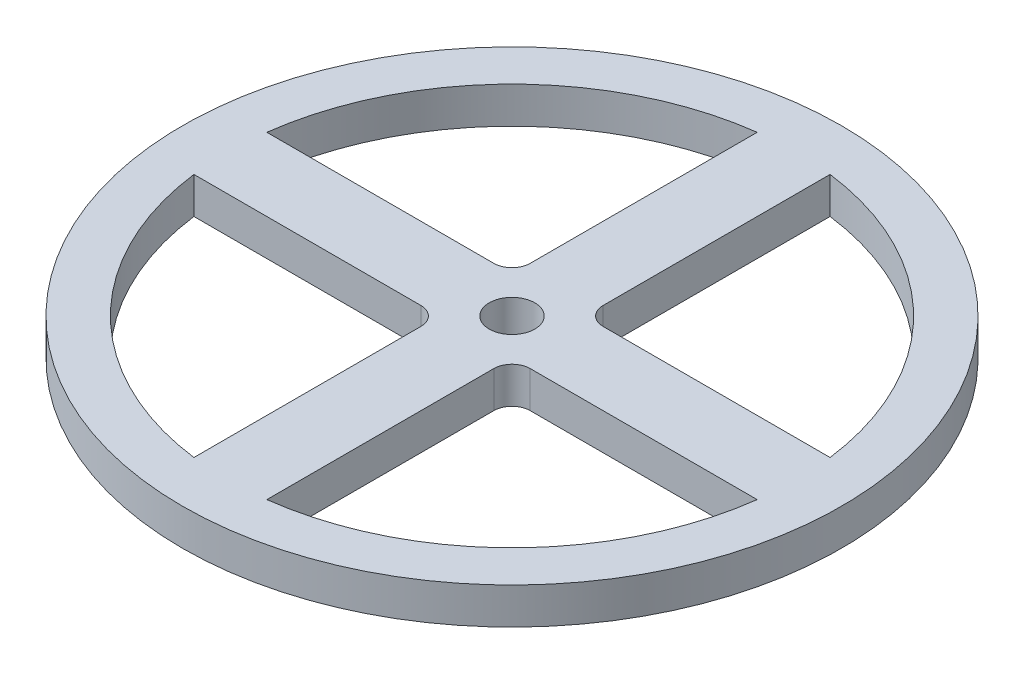
ISO-10303-21;
HEADER;
FILE_DESCRIPTION(('STEP AP214'),'2;1');
FILE_NAME('part.step','',(''),(''),'','','');
FILE_SCHEMA(('AUTOMOTIVE_DESIGN { 1 0 10303 214 1 1 1 1 }'));
ENDSEC;
DATA;
#1=APPLICATION_CONTEXT('core data for automotive mechanical design processes');
#2=APPLICATION_PROTOCOL_DEFINITION('international standard','automotive_design',2000,#1);
#3=PRODUCT_CONTEXT('',#1,'mechanical');
#4=PRODUCT('Part','Part','',(#3));
#5=PRODUCT_RELATED_PRODUCT_CATEGORY('part','',(#4));
#6=PRODUCT_DEFINITION_FORMATION('','',#4);
#7=PRODUCT_DEFINITION_CONTEXT('part definition',#1,'design');
#8=PRODUCT_DEFINITION('design','',#6,#7);
#9=PRODUCT_DEFINITION_SHAPE('','',#8);
#10=(LENGTH_UNIT() NAMED_UNIT(*) SI_UNIT(.MILLI.,.METRE.));
#11=(NAMED_UNIT(*) PLANE_ANGLE_UNIT() SI_UNIT($,.RADIAN.));
#12=(NAMED_UNIT(*) SI_UNIT($,.STERADIAN.) SOLID_ANGLE_UNIT());
#13=UNCERTAINTY_MEASURE_WITH_UNIT(LENGTH_MEASURE(1.E-05),#10,'distance_accuracy_value','');
#14=(GEOMETRIC_REPRESENTATION_CONTEXT(3) GLOBAL_UNCERTAINTY_ASSIGNED_CONTEXT((#13)) GLOBAL_UNIT_ASSIGNED_CONTEXT((#10,
#11,#12)) REPRESENTATION_CONTEXT('',''));
#15=CARTESIAN_POINT('',(0.,0.,0.));
#16=DIRECTION('',(0.,0.,1.));
#17=DIRECTION('',(1.,0.,0.));
#18=AXIS2_PLACEMENT_3D('',#15,#16,#17);
#19=CARTESIAN_POINT('',(0.,4.,4.));
#20=DIRECTION('',(0.,0.,-1.));
#21=DIRECTION('',(-1.,0.,0.));
#22=AXIS2_PLACEMENT_3D('',#19,#20,#21);
#23=PLANE('',#22);
#24=DIRECTION('',(1.,0.,0.));
#25=VECTOR('',#24,1.);
#26=CARTESIAN_POINT('',(0.,0.,4.));
#27=LINE('',#26,#25);
#28=CARTESIAN_POINT('',(-30.8921106433342,0.,4.));
#29=VERTEX_POINT('',#28);
#30=CARTESIAN_POINT('',(-5.99999999999999,0.,4.));
#31=VERTEX_POINT('',#30);
#32=EDGE_CURVE('E222',#29,#31,#27,.T.);
#33=ORIENTED_EDGE('',*,*,#32,.T.);
#34=DIRECTION('',(0.,-1.,0.));
#35=VECTOR('',#34,1.);
#36=CARTESIAN_POINT('',(-5.99999999999999,4.,4.));
#37=LINE('',#36,#35);
#38=CARTESIAN_POINT('',(-5.99999999999999,4.,4.));
#39=VERTEX_POINT('',#38);
#40=EDGE_CURVE('E11',#39,#31,#37,.T.);
#41=ORIENTED_EDGE('',*,*,#40,.F.);
#42=DIRECTION('',(1.,0.,0.));
#43=VECTOR('',#42,1.);
#44=CARTESIAN_POINT('',(0.,4.,4.));
#45=LINE('',#44,#43);
#46=CARTESIAN_POINT('',(-30.8921106433342,4.,4.));
#47=VERTEX_POINT('',#46);
#48=EDGE_CURVE('E163',#47,#39,#45,.T.);
#49=ORIENTED_EDGE('',*,*,#48,.F.);
#50=DIRECTION('',(0.,-1.,0.));
#51=VECTOR('',#50,1.);
#52=CARTESIAN_POINT('',(-30.8921106433342,4.,4.));
#53=LINE('',#52,#51);
#54=EDGE_CURVE('E55',#47,#29,#53,.T.);
#55=ORIENTED_EDGE('',*,*,#54,.T.);
#56=EDGE_LOOP('',(#33,#41,#49,#55));
#57=FACE_BOUND('',#56,.T.);
#58=ADVANCED_FACE('F36',(#57),#23,.F.);
#59=CARTESIAN_POINT('',(-5.99999999999999,4.,6.));
#60=DIRECTION('',(0.,-1.,0.));
#61=DIRECTION('',(0.,0.,-1.));
#62=AXIS2_PLACEMENT_3D('',#59,#60,#61);
#63=CYLINDRICAL_SURFACE('',#62,2.);
#64=CARTESIAN_POINT('',(-5.99999999999999,0.,6.));
#65=DIRECTION('',(0.,1.,0.));
#66=DIRECTION('',(0.,0.,1.));
#67=AXIS2_PLACEMENT_3D('',#64,#65,#66);
#68=CIRCLE('',#67,2.);
#69=CARTESIAN_POINT('',(-3.99999999999999,0.,6.));
#70=VERTEX_POINT('',#69);
#71=EDGE_CURVE('E169',#31,#70,#68,.F.);
#72=ORIENTED_EDGE('',*,*,#71,.T.);
#73=DIRECTION('',(0.,-1.,0.));
#74=VECTOR('',#73,1.);
#75=CARTESIAN_POINT('',(-3.99999999999999,4.,6.));
#76=LINE('',#75,#74);
#77=CARTESIAN_POINT('',(-3.99999999999999,4.,6.));
#78=VERTEX_POINT('',#77);
#79=EDGE_CURVE('E46',#78,#70,#76,.T.);
#80=ORIENTED_EDGE('',*,*,#79,.F.);
#81=CARTESIAN_POINT('',(-5.99999999999999,4.,6.));
#82=DIRECTION('',(0.,1.,0.));
#83=DIRECTION('',(0.,0.,1.));
#84=AXIS2_PLACEMENT_3D('',#81,#82,#83);
#85=CIRCLE('',#84,2.);
#86=EDGE_CURVE('E157',#39,#78,#85,.F.);
#87=ORIENTED_EDGE('',*,*,#86,.F.);
#88=ORIENTED_EDGE('',*,*,#40,.T.);
#89=EDGE_LOOP('',(#72,#80,#87,#88));
#90=FACE_BOUND('',#89,.T.);
#91=ADVANCED_FACE('F168',(#90),#63,.F.);
#92=CARTESIAN_POINT('',(-3.99999999999999,4.,0.));
#93=DIRECTION('',(1.,0.,0.));
#94=DIRECTION('',(0.,0.,-1.));
#95=AXIS2_PLACEMENT_3D('',#92,#93,#94);
#96=PLANE('',#95);
#97=DIRECTION('',(0.,0.,1.));
#98=VECTOR('',#97,1.);
#99=CARTESIAN_POINT('',(-3.99999999999999,0.,0.));
#100=LINE('',#99,#98);
#101=CARTESIAN_POINT('',(-3.99999999999999,0.,30.8921106433342));
#102=VERTEX_POINT('',#101);
#103=EDGE_CURVE('E225',#70,#102,#100,.T.);
#104=ORIENTED_EDGE('',*,*,#103,.T.);
#105=DIRECTION('',(0.,-1.,0.));
#106=VECTOR('',#105,1.);
#107=CARTESIAN_POINT('',(-3.99999999999999,4.,30.8921106433342));
#108=LINE('',#107,#106);
#109=CARTESIAN_POINT('',(-3.99999999999999,4.,30.8921106433342));
#110=VERTEX_POINT('',#109);
#111=EDGE_CURVE('E106',#110,#102,#108,.T.);
#112=ORIENTED_EDGE('',*,*,#111,.F.);
#113=DIRECTION('',(0.,0.,1.));
#114=VECTOR('',#113,1.);
#115=CARTESIAN_POINT('',(-3.99999999999999,4.,0.));
#116=LINE('',#115,#114);
#117=EDGE_CURVE('E162',#78,#110,#116,.T.);
#118=ORIENTED_EDGE('',*,*,#117,.F.);
#119=ORIENTED_EDGE('',*,*,#79,.T.);
#120=EDGE_LOOP('',(#104,#112,#118,#119));
#121=FACE_BOUND('',#120,.T.);
#122=ADVANCED_FACE('F173',(#121),#96,.F.);
#123=CARTESIAN_POINT('',(0.,4.,0.));
#124=DIRECTION('',(0.,-1.,0.));
#125=DIRECTION('',(0.,0.,-1.));
#126=AXIS2_PLACEMENT_3D('',#123,#124,#125);
#127=CYLINDRICAL_SURFACE('',#126,31.15);
#128=CARTESIAN_POINT('',(0.,0.,0.));
#129=DIRECTION('',(0.,1.,0.));
#130=DIRECTION('',(0.,0.,1.));
#131=AXIS2_PLACEMENT_3D('',#128,#129,#130);
#132=CIRCLE('',#131,31.15);
#133=CARTESIAN_POINT('',(-3.99999999999999,0.,-30.8921106433342));
#134=VERTEX_POINT('',#133);
#135=CARTESIAN_POINT('',(-30.8921106433342,0.,-4.));
#136=VERTEX_POINT('',#135);
#137=EDGE_CURVE('E204',#134,#136,#132,.T.);
#138=ORIENTED_EDGE('',*,*,#137,.F.);
#139=DIRECTION('',(0.,-1.,0.));
#140=VECTOR('',#139,1.);
#141=CARTESIAN_POINT('',(-3.99999999999999,4.,-30.8921106433342));
#142=LINE('',#141,#140);
#143=CARTESIAN_POINT('',(-3.99999999999999,4.,-30.8921106433342));
#144=VERTEX_POINT('',#143);
#145=EDGE_CURVE('E232',#144,#134,#142,.T.);
#146=ORIENTED_EDGE('',*,*,#145,.F.);
#147=CARTESIAN_POINT('',(0.,4.,0.));
#148=DIRECTION('',(0.,1.,0.));
#149=DIRECTION('',(0.,0.,1.));
#150=AXIS2_PLACEMENT_3D('',#147,#148,#149);
#151=CIRCLE('',#150,31.15);
#152=CARTESIAN_POINT('',(-30.8921106433342,4.,-4.));
#153=VERTEX_POINT('',#152);
#154=EDGE_CURVE('E292',#144,#153,#151,.T.);
#155=ORIENTED_EDGE('',*,*,#154,.T.);
#156=DIRECTION('',(0.,-1.,0.));
#157=VECTOR('',#156,1.);
#158=CARTESIAN_POINT('',(-30.8921106433342,4.,-4.));
#159=LINE('',#158,#157);
#160=EDGE_CURVE('E234',#153,#136,#159,.T.);
#161=ORIENTED_EDGE('',*,*,#160,.T.);
#162=EDGE_LOOP('',(#138,#146,#155,#161));
#163=FACE_BOUND('',#162,.T.);
#164=ADVANCED_FACE('F354',(#163),#127,.F.);
#165=CARTESIAN_POINT('',(-4.,4.,0.));
#166=DIRECTION('',(1.,0.,0.));
#167=DIRECTION('',(0.,0.,-1.));
#168=AXIS2_PLACEMENT_3D('',#165,#166,#167);
#169=PLANE('',#168);
#170=DIRECTION('',(0.,0.,1.));
#171=VECTOR('',#170,1.);
#172=CARTESIAN_POINT('',(-4.,0.,0.));
#173=LINE('',#172,#171);
#174=CARTESIAN_POINT('',(-3.99999999999999,0.,-6.));
#175=VERTEX_POINT('',#174);
#176=EDGE_CURVE('E207',#134,#175,#173,.T.);
#177=ORIENTED_EDGE('',*,*,#176,.T.);
#178=DIRECTION('',(0.,-1.,0.));
#179=VECTOR('',#178,1.);
#180=CARTESIAN_POINT('',(-3.99999999999999,4.,-6.));
#181=LINE('',#180,#179);
#182=CARTESIAN_POINT('',(-3.99999999999999,4.,-6.));
#183=VERTEX_POINT('',#182);
#184=EDGE_CURVE('E239',#183,#175,#181,.T.);
#185=ORIENTED_EDGE('',*,*,#184,.F.);
#186=DIRECTION('',(0.,0.,1.));
#187=VECTOR('',#186,1.);
#188=CARTESIAN_POINT('',(-4.,4.,0.));
#189=LINE('',#188,#187);
#190=EDGE_CURVE('E295',#144,#183,#189,.T.);
#191=ORIENTED_EDGE('',*,*,#190,.F.);
#192=ORIENTED_EDGE('',*,*,#145,.T.);
#193=EDGE_LOOP('',(#177,#185,#191,#192));
#194=FACE_BOUND('',#193,.T.);
#195=ADVANCED_FACE('F350',(#194),#169,.F.);
#196=CARTESIAN_POINT('',(-5.99999999999999,4.,-6.));
#197=DIRECTION('',(0.,-1.,0.));
#198=DIRECTION('',(0.,0.,-1.));
#199=AXIS2_PLACEMENT_3D('',#196,#197,#198);
#200=CYLINDRICAL_SURFACE('',#199,2.);
#201=CARTESIAN_POINT('',(-5.99999999999999,0.,-6.));
#202=DIRECTION('',(0.,1.,0.));
#203=DIRECTION('',(0.,0.,1.));
#204=AXIS2_PLACEMENT_3D('',#201,#202,#203);
#205=CIRCLE('',#204,2.);
#206=CARTESIAN_POINT('',(-5.99999999999999,0.,-4.));
#207=VERTEX_POINT('',#206);
#208=EDGE_CURVE('E210',#207,#175,#205,.T.);
#209=ORIENTED_EDGE('',*,*,#208,.F.);
#210=DIRECTION('',(0.,-1.,0.));
#211=VECTOR('',#210,1.);
#212=CARTESIAN_POINT('',(-5.99999999999999,4.,-4.));
#213=LINE('',#212,#211);
#214=CARTESIAN_POINT('',(-5.99999999999999,4.,-4.));
#215=VERTEX_POINT('',#214);
#216=EDGE_CURVE('E236',#215,#207,#213,.T.);
#217=ORIENTED_EDGE('',*,*,#216,.F.);
#218=CARTESIAN_POINT('',(-5.99999999999999,4.,-6.));
#219=DIRECTION('',(0.,1.,0.));
#220=DIRECTION('',(0.,0.,1.));
#221=AXIS2_PLACEMENT_3D('',#218,#219,#220);
#222=CIRCLE('',#221,2.);
#223=EDGE_CURVE('E297',#215,#183,#222,.T.);
#224=ORIENTED_EDGE('',*,*,#223,.T.);
#225=ORIENTED_EDGE('',*,*,#184,.T.);
#226=EDGE_LOOP('',(#209,#217,#224,#225));
#227=FACE_BOUND('',#226,.T.);
#228=ADVANCED_FACE('F346',(#227),#200,.F.);
#229=CARTESIAN_POINT('',(0.,4.,0.));
#230=DIRECTION('',(0.,-1.,0.));
#231=DIRECTION('',(0.,0.,-1.));
#232=AXIS2_PLACEMENT_3D('',#229,#230,#231);
#233=CYLINDRICAL_SURFACE('',#232,31.15);
#234=CARTESIAN_POINT('',(0.,0.,0.));
#235=DIRECTION('',(0.,1.,0.));
#236=DIRECTION('',(0.,0.,1.));
#237=AXIS2_PLACEMENT_3D('',#234,#235,#236);
#238=CIRCLE('',#237,31.15);
#239=CARTESIAN_POINT('',(30.8921106433342,0.,-4.));
#240=VERTEX_POINT('',#239);
#241=CARTESIAN_POINT('',(4.00000000000001,0.,-30.8921106433342));
#242=VERTEX_POINT('',#241);
#243=EDGE_CURVE('E192',#240,#242,#238,.T.);
#244=ORIENTED_EDGE('',*,*,#243,.F.);
#245=DIRECTION('',(0.,-1.,0.));
#246=VECTOR('',#245,1.);
#247=CARTESIAN_POINT('',(30.8921106433342,4.,-4.));
#248=LINE('',#247,#246);
#249=CARTESIAN_POINT('',(30.8921106433342,4.,-4.));
#250=VERTEX_POINT('',#249);
#251=EDGE_CURVE('E237',#250,#240,#248,.T.);
#252=ORIENTED_EDGE('',*,*,#251,.F.);
#253=CARTESIAN_POINT('',(0.,4.,0.));
#254=DIRECTION('',(0.,1.,0.));
#255=DIRECTION('',(0.,0.,1.));
#256=AXIS2_PLACEMENT_3D('',#253,#254,#255);
#257=CIRCLE('',#256,31.15);
#258=CARTESIAN_POINT('',(4.00000000000001,4.,-30.8921106433342));
#259=VERTEX_POINT('',#258);
#260=EDGE_CURVE('E274',#250,#259,#257,.T.);
#261=ORIENTED_EDGE('',*,*,#260,.T.);
#262=DIRECTION('',(0.,-1.,0.));
#263=VECTOR('',#262,1.);
#264=CARTESIAN_POINT('',(4.00000000000001,4.,-30.8921106433342));
#265=LINE('',#264,#263);
#266=EDGE_CURVE('E242',#259,#242,#265,.T.);
#267=ORIENTED_EDGE('',*,*,#266,.T.);
#268=EDGE_LOOP('',(#244,#252,#261,#267));
#269=FACE_BOUND('',#268,.T.);
#270=ADVANCED_FACE('F349',(#269),#233,.F.);
#271=CARTESIAN_POINT('',(0.,4.,-4.));
#272=DIRECTION('',(0.,0.,-1.));
#273=DIRECTION('',(-1.,0.,0.));
#274=AXIS2_PLACEMENT_3D('',#271,#272,#273);
#275=PLANE('',#274);
#276=DIRECTION('',(1.,0.,0.));
#277=VECTOR('',#276,1.);
#278=CARTESIAN_POINT('',(0.,0.,-4.));
#279=LINE('',#278,#277);
#280=CARTESIAN_POINT('',(6.00000000000001,0.,-4.));
#281=VERTEX_POINT('',#280);
#282=EDGE_CURVE('E195',#281,#240,#279,.T.);
#283=ORIENTED_EDGE('',*,*,#282,.F.);
#284=DIRECTION('',(0.,-1.,0.));
#285=VECTOR('',#284,1.);
#286=CARTESIAN_POINT('',(6.00000000000001,4.,-4.));
#287=LINE('',#286,#285);
#288=CARTESIAN_POINT('',(6.00000000000001,4.,-4.));
#289=VERTEX_POINT('',#288);
#290=EDGE_CURVE('E246',#289,#281,#287,.T.);
#291=ORIENTED_EDGE('',*,*,#290,.F.);
#292=DIRECTION('',(1.,0.,0.));
#293=VECTOR('',#292,1.);
#294=CARTESIAN_POINT('',(0.,4.,-4.));
#295=LINE('',#294,#293);
#296=EDGE_CURVE('E283',#289,#250,#295,.T.);
#297=ORIENTED_EDGE('',*,*,#296,.T.);
#298=ORIENTED_EDGE('',*,*,#251,.T.);
#299=EDGE_LOOP('',(#283,#291,#297,#298));
#300=FACE_BOUND('',#299,.T.);
#301=ADVANCED_FACE('F365',(#300),#275,.T.);
#302=CARTESIAN_POINT('',(6.00000000000001,4.,-6.));
#303=DIRECTION('',(0.,-1.,0.));
#304=DIRECTION('',(0.,0.,-1.));
#305=AXIS2_PLACEMENT_3D('',#302,#303,#304);
#306=CYLINDRICAL_SURFACE('',#305,2.);
#307=CARTESIAN_POINT('',(6.00000000000001,0.,-6.));
#308=DIRECTION('',(0.,1.,0.));
#309=DIRECTION('',(0.,0.,1.));
#310=AXIS2_PLACEMENT_3D('',#307,#308,#309);
#311=CIRCLE('',#310,2.);
#312=CARTESIAN_POINT('',(4.00000000000001,0.,-6.));
#313=VERTEX_POINT('',#312);
#314=EDGE_CURVE('E198',#313,#281,#311,.T.);
#315=ORIENTED_EDGE('',*,*,#314,.F.);
#316=DIRECTION('',(0.,-1.,0.));
#317=VECTOR('',#316,1.);
#318=CARTESIAN_POINT('',(4.00000000000001,4.,-6.));
#319=LINE('',#318,#317);
#320=CARTESIAN_POINT('',(4.00000000000001,4.,-6.));
#321=VERTEX_POINT('',#320);
#322=EDGE_CURVE('E244',#321,#313,#319,.T.);
#323=ORIENTED_EDGE('',*,*,#322,.F.);
#324=CARTESIAN_POINT('',(6.00000000000001,4.,-6.));
#325=DIRECTION('',(0.,1.,0.));
#326=DIRECTION('',(0.,0.,1.));
#327=AXIS2_PLACEMENT_3D('',#324,#325,#326);
#328=CIRCLE('',#327,2.);
#329=EDGE_CURVE('E286',#321,#289,#328,.T.);
#330=ORIENTED_EDGE('',*,*,#329,.T.);
#331=ORIENTED_EDGE('',*,*,#290,.T.);
#332=EDGE_LOOP('',(#315,#323,#330,#331));
#333=FACE_BOUND('',#332,.T.);
#334=ADVANCED_FACE('F362',(#333),#306,.F.);
#335=CARTESIAN_POINT('',(0.,4.,0.));
#336=DIRECTION('',(0.,-1.,0.));
#337=DIRECTION('',(0.,0.,-1.));
#338=AXIS2_PLACEMENT_3D('',#335,#336,#337);
#339=CYLINDRICAL_SURFACE('',#338,31.15);
#340=CARTESIAN_POINT('',(0.,0.,0.));
#341=DIRECTION('',(0.,1.,0.));
#342=DIRECTION('',(0.,0.,1.));
#343=AXIS2_PLACEMENT_3D('',#340,#341,#342);
#344=CIRCLE('',#343,31.15);
#345=CARTESIAN_POINT('',(4.00000000000001,0.,30.8921106433342));
#346=VERTEX_POINT('',#345);
#347=CARTESIAN_POINT('',(30.8921106433342,0.,4.));
#348=VERTEX_POINT('',#347);
#349=EDGE_CURVE('E180',#346,#348,#344,.T.);
#350=ORIENTED_EDGE('',*,*,#349,.F.);
#351=DIRECTION('',(0.,-1.,0.));
#352=VECTOR('',#351,1.);
#353=CARTESIAN_POINT('',(4.00000000000001,4.,30.8921106433342));
#354=LINE('',#353,#352);
#355=CARTESIAN_POINT('',(4.00000000000001,4.,30.8921106433342));
#356=VERTEX_POINT('',#355);
#357=EDGE_CURVE('E40',#356,#346,#354,.T.);
#358=ORIENTED_EDGE('',*,*,#357,.F.);
#359=CARTESIAN_POINT('',(0.,4.,0.));
#360=DIRECTION('',(0.,1.,0.));
#361=DIRECTION('',(0.,0.,1.));
#362=AXIS2_PLACEMENT_3D('',#359,#360,#361);
#363=CIRCLE('',#362,31.15);
#364=CARTESIAN_POINT('',(30.8921106433342,4.,4.));
#365=VERTEX_POINT('',#364);
#366=EDGE_CURVE('E230',#356,#365,#363,.T.);
#367=ORIENTED_EDGE('',*,*,#366,.T.);
#368=DIRECTION('',(0.,-1.,0.));
#369=VECTOR('',#368,1.);
#370=CARTESIAN_POINT('',(30.8921106433342,4.,4.));
#371=LINE('',#370,#369);
#372=EDGE_CURVE('E176',#365,#348,#371,.T.);
#373=ORIENTED_EDGE('',*,*,#372,.T.);
#374=EDGE_LOOP('',(#350,#358,#367,#373));
#375=FACE_BOUND('',#374,.T.);
#376=ADVANCED_FACE('F38',(#375),#339,.F.);
#377=CARTESIAN_POINT('',(4.00000000000001,4.,0.));
#378=DIRECTION('',(1.,0.,0.));
#379=DIRECTION('',(0.,0.,-1.));
#380=AXIS2_PLACEMENT_3D('',#377,#378,#379);
#381=PLANE('',#380);
#382=DIRECTION('',(0.,0.,1.));
#383=VECTOR('',#382,1.);
#384=CARTESIAN_POINT('',(4.00000000000001,0.,0.));
#385=LINE('',#384,#383);
#386=CARTESIAN_POINT('',(4.00000000000001,0.,6.));
#387=VERTEX_POINT('',#386);
#388=EDGE_CURVE('E183',#387,#346,#385,.T.);
#389=ORIENTED_EDGE('',*,*,#388,.F.);
#390=DIRECTION('',(0.,-1.,0.));
#391=VECTOR('',#390,1.);
#392=CARTESIAN_POINT('',(4.00000000000001,4.,6.));
#393=LINE('',#392,#391);
#394=CARTESIAN_POINT('',(4.00000000000001,4.,6.));
#395=VERTEX_POINT('',#394);
#396=EDGE_CURVE('E251',#395,#387,#393,.T.);
#397=ORIENTED_EDGE('',*,*,#396,.F.);
#398=DIRECTION('',(0.,0.,1.));
#399=VECTOR('',#398,1.);
#400=CARTESIAN_POINT('',(4.00000000000001,4.,0.));
#401=LINE('',#400,#399);
#402=EDGE_CURVE('E260',#395,#356,#401,.T.);
#403=ORIENTED_EDGE('',*,*,#402,.T.);
#404=ORIENTED_EDGE('',*,*,#357,.T.);
#405=EDGE_LOOP('',(#389,#397,#403,#404));
#406=FACE_BOUND('',#405,.T.);
#407=ADVANCED_FACE('F258',(#406),#381,.T.);
#408=CARTESIAN_POINT('',(6.00000000000001,4.,6.));
#409=DIRECTION('',(0.,-1.,0.));
#410=DIRECTION('',(0.,0.,-1.));
#411=AXIS2_PLACEMENT_3D('',#408,#409,#410);
#412=CYLINDRICAL_SURFACE('',#411,2.);
#413=CARTESIAN_POINT('',(6.00000000000001,0.,6.));
#414=DIRECTION('',(0.,1.,0.));
#415=DIRECTION('',(0.,0.,1.));
#416=AXIS2_PLACEMENT_3D('',#413,#414,#415);
#417=CIRCLE('',#416,2.);
#418=CARTESIAN_POINT('',(6.00000000000001,0.,4.));
#419=VERTEX_POINT('',#418);
#420=EDGE_CURVE('E186',#419,#387,#417,.T.);
#421=ORIENTED_EDGE('',*,*,#420,.F.);
#422=DIRECTION('',(0.,-1.,0.));
#423=VECTOR('',#422,1.);
#424=CARTESIAN_POINT('',(6.00000000000001,4.,4.));
#425=LINE('',#424,#423);
#426=CARTESIAN_POINT('',(6.00000000000001,4.,4.));
#427=VERTEX_POINT('',#426);
#428=EDGE_CURVE('E250',#427,#419,#425,.T.);
#429=ORIENTED_EDGE('',*,*,#428,.F.);
#430=CARTESIAN_POINT('',(6.00000000000001,4.,6.));
#431=DIRECTION('',(0.,1.,0.));
#432=DIRECTION('',(0.,0.,1.));
#433=AXIS2_PLACEMENT_3D('',#430,#431,#432);
#434=CIRCLE('',#433,2.);
#435=EDGE_CURVE('E269',#427,#395,#434,.T.);
#436=ORIENTED_EDGE('',*,*,#435,.T.);
#437=ORIENTED_EDGE('',*,*,#396,.T.);
#438=EDGE_LOOP('',(#421,#429,#436,#437));
#439=FACE_BOUND('',#438,.T.);
#440=ADVANCED_FACE('F266',(#439),#412,.F.);
#441=CARTESIAN_POINT('',(0.,4.,0.));
#442=DIRECTION('',(0.,-1.,0.));
#443=DIRECTION('',(0.,0.,-1.));
#444=AXIS2_PLACEMENT_3D('',#441,#442,#443);
#445=CYLINDRICAL_SURFACE('',#444,36.15);
#446=CARTESIAN_POINT('',(0.,4.,0.));
#447=DIRECTION('',(0.,1.,0.));
#448=DIRECTION('',(0.,0.,1.));
#449=AXIS2_PLACEMENT_3D('',#446,#447,#448);
#450=CIRCLE('',#449,36.15);
#451=CARTESIAN_POINT('',(0.,4.,36.15));
#452=VERTEX_POINT('',#451);
#453=EDGE_CURVE('E306',#452,#452,#450,.T.);
#454=ORIENTED_EDGE('',*,*,#453,.F.);
#455=EDGE_LOOP('',(#454));
#456=FACE_BOUND('',#455,.T.);
#457=CARTESIAN_POINT('',(0.,0.,0.));
#458=DIRECTION('',(0.,1.,0.));
#459=DIRECTION('',(0.,0.,1.));
#460=AXIS2_PLACEMENT_3D('',#457,#458,#459);
#461=CIRCLE('',#460,36.15);
#462=CARTESIAN_POINT('',(0.,0.,36.15));
#463=VERTEX_POINT('',#462);
#464=EDGE_CURVE('E219',#463,#463,#461,.T.);
#465=ORIENTED_EDGE('',*,*,#464,.T.);
#466=EDGE_LOOP('',(#465));
#467=FACE_BOUND('',#466,.T.);
#468=ADVANCED_FACE('F311',(#456,#467),#445,.T.);
#469=CARTESIAN_POINT('',(0.,4.,0.));
#470=DIRECTION('',(0.,-1.,0.));
#471=DIRECTION('',(0.,0.,-1.));
#472=AXIS2_PLACEMENT_3D('',#469,#470,#471);
#473=CYLINDRICAL_SURFACE('',#472,2.5);
#474=CARTESIAN_POINT('',(0.,4.,0.));
#475=DIRECTION('',(0.,1.,0.));
#476=DIRECTION('',(0.,0.,1.));
#477=AXIS2_PLACEMENT_3D('',#474,#475,#476);
#478=CIRCLE('',#477,2.5);
#479=CARTESIAN_POINT('',(0.,4.,2.5));
#480=VERTEX_POINT('',#479);
#481=EDGE_CURVE('E303',#480,#480,#478,.T.);
#482=ORIENTED_EDGE('',*,*,#481,.T.);
#483=EDGE_LOOP('',(#482));
#484=FACE_BOUND('',#483,.T.);
#485=CARTESIAN_POINT('',(0.,0.,0.));
#486=DIRECTION('',(0.,1.,0.));
#487=DIRECTION('',(0.,0.,1.));
#488=AXIS2_PLACEMENT_3D('',#485,#486,#487);
#489=CIRCLE('',#488,2.5);
#490=CARTESIAN_POINT('',(0.,0.,2.5));
#491=VERTEX_POINT('',#490);
#492=EDGE_CURVE('E216',#491,#491,#489,.T.);
#493=ORIENTED_EDGE('',*,*,#492,.F.);
#494=EDGE_LOOP('',(#493));
#495=FACE_BOUND('',#494,.T.);
#496=ADVANCED_FACE('F314',(#484,#495),#473,.F.);
#497=CARTESIAN_POINT('',(0.,4.,-4.));
#498=DIRECTION('',(0.,0.,-1.));
#499=DIRECTION('',(-1.,0.,0.));
#500=AXIS2_PLACEMENT_3D('',#497,#498,#499);
#501=PLANE('',#500);
#502=DIRECTION('',(1.,0.,0.));
#503=VECTOR('',#502,1.);
#504=CARTESIAN_POINT('',(0.,0.,-4.));
#505=LINE('',#504,#503);
#506=EDGE_CURVE('E213',#136,#207,#505,.T.);
#507=ORIENTED_EDGE('',*,*,#506,.F.);
#508=ORIENTED_EDGE('',*,*,#160,.F.);
#509=DIRECTION('',(1.,0.,0.));
#510=VECTOR('',#509,1.);
#511=CARTESIAN_POINT('',(0.,4.,-4.));
#512=LINE('',#511,#510);
#513=EDGE_CURVE('E300',#153,#215,#512,.T.);
#514=ORIENTED_EDGE('',*,*,#513,.T.);
#515=ORIENTED_EDGE('',*,*,#216,.T.);
#516=EDGE_LOOP('',(#507,#508,#514,#515));
#517=FACE_BOUND('',#516,.T.);
#518=ADVANCED_FACE('F341',(#517),#501,.T.);
#519=CARTESIAN_POINT('',(4.,4.,0.));
#520=DIRECTION('',(1.,0.,0.));
#521=DIRECTION('',(0.,0.,-1.));
#522=AXIS2_PLACEMENT_3D('',#519,#520,#521);
#523=PLANE('',#522);
#524=DIRECTION('',(0.,0.,1.));
#525=VECTOR('',#524,1.);
#526=CARTESIAN_POINT('',(4.,0.,0.));
#527=LINE('',#526,#525);
#528=EDGE_CURVE('E201',#242,#313,#527,.T.);
#529=ORIENTED_EDGE('',*,*,#528,.F.);
#530=ORIENTED_EDGE('',*,*,#266,.F.);
#531=DIRECTION('',(0.,0.,1.));
#532=VECTOR('',#531,1.);
#533=CARTESIAN_POINT('',(4.,4.,0.));
#534=LINE('',#533,#532);
#535=EDGE_CURVE('E289',#259,#321,#534,.T.);
#536=ORIENTED_EDGE('',*,*,#535,.T.);
#537=ORIENTED_EDGE('',*,*,#322,.T.);
#538=EDGE_LOOP('',(#529,#530,#536,#537));
#539=FACE_BOUND('',#538,.T.);
#540=ADVANCED_FACE('F329',(#539),#523,.T.);
#541=CARTESIAN_POINT('',(0.,4.,4.));
#542=DIRECTION('',(0.,0.,-1.));
#543=DIRECTION('',(-1.,0.,0.));
#544=AXIS2_PLACEMENT_3D('',#541,#542,#543);
#545=PLANE('',#544);
#546=DIRECTION('',(1.,0.,0.));
#547=VECTOR('',#546,1.);
#548=CARTESIAN_POINT('',(0.,0.,4.));
#549=LINE('',#548,#547);
#550=EDGE_CURVE('E189',#419,#348,#549,.T.);
#551=ORIENTED_EDGE('',*,*,#550,.T.);
#552=ORIENTED_EDGE('',*,*,#372,.F.);
#553=DIRECTION('',(1.,0.,0.));
#554=VECTOR('',#553,1.);
#555=CARTESIAN_POINT('',(0.,4.,4.));
#556=LINE('',#555,#554);
#557=EDGE_CURVE('E271',#427,#365,#556,.T.);
#558=ORIENTED_EDGE('',*,*,#557,.F.);
#559=ORIENTED_EDGE('',*,*,#428,.T.);
#560=EDGE_LOOP('',(#551,#552,#558,#559));
#561=FACE_BOUND('',#560,.T.);
#562=ADVANCED_FACE('F272',(#561),#545,.F.);
#563=CARTESIAN_POINT('',(0.,4.,0.));
#564=DIRECTION('',(0.,-1.,0.));
#565=DIRECTION('',(0.,0.,-1.));
#566=AXIS2_PLACEMENT_3D('',#563,#564,#565);
#567=CYLINDRICAL_SURFACE('',#566,31.15);
#568=CARTESIAN_POINT('',(0.,0.,0.));
#569=DIRECTION('',(0.,1.,0.));
#570=DIRECTION('',(0.,0.,1.));
#571=AXIS2_PLACEMENT_3D('',#568,#569,#570);
#572=CIRCLE('',#571,31.15);
#573=EDGE_CURVE('E227',#29,#102,#572,.T.);
#574=ORIENTED_EDGE('',*,*,#573,.F.);
#575=ORIENTED_EDGE('',*,*,#54,.F.);
#576=CARTESIAN_POINT('',(0.,4.,0.));
#577=DIRECTION('',(0.,1.,0.));
#578=DIRECTION('',(0.,0.,1.));
#579=AXIS2_PLACEMENT_3D('',#576,#577,#578);
#580=CIRCLE('',#579,31.15);
#581=EDGE_CURVE('E174',#47,#110,#580,.T.);
#582=ORIENTED_EDGE('',*,*,#581,.T.);
#583=ORIENTED_EDGE('',*,*,#111,.T.);
#584=EDGE_LOOP('',(#574,#575,#582,#583));
#585=FACE_BOUND('',#584,.T.);
#586=ADVANCED_FACE('F321',(#585),#567,.F.);
#587=CARTESIAN_POINT('',(0.,4.,0.));
#588=DIRECTION('',(0.,1.,0.));
#589=DIRECTION('',(0.,0.,1.));
#590=AXIS2_PLACEMENT_3D('',#587,#588,#589);
#591=PLANE('',#590);
#592=ORIENTED_EDGE('',*,*,#366,.F.);
#593=ORIENTED_EDGE('',*,*,#402,.F.);
#594=ORIENTED_EDGE('',*,*,#435,.F.);
#595=ORIENTED_EDGE('',*,*,#557,.T.);
#596=EDGE_LOOP('',(#592,#593,#594,#595));
#597=FACE_BOUND('',#596,.T.);
#598=ORIENTED_EDGE('',*,*,#260,.F.);
#599=ORIENTED_EDGE('',*,*,#296,.F.);
#600=ORIENTED_EDGE('',*,*,#329,.F.);
#601=ORIENTED_EDGE('',*,*,#535,.F.);
#602=EDGE_LOOP('',(#598,#599,#600,#601));
#603=FACE_BOUND('',#602,.T.);
#604=ORIENTED_EDGE('',*,*,#154,.F.);
#605=ORIENTED_EDGE('',*,*,#190,.T.);
#606=ORIENTED_EDGE('',*,*,#223,.F.);
#607=ORIENTED_EDGE('',*,*,#513,.F.);
#608=EDGE_LOOP('',(#604,#605,#606,#607));
#609=FACE_BOUND('',#608,.T.);
#610=ORIENTED_EDGE('',*,*,#481,.F.);
#611=EDGE_LOOP('',(#610));
#612=FACE_BOUND('',#611,.T.);
#613=ORIENTED_EDGE('',*,*,#453,.T.);
#614=EDGE_LOOP('',(#613));
#615=FACE_BOUND('',#614,.T.);
#616=ORIENTED_EDGE('',*,*,#48,.T.);
#617=ORIENTED_EDGE('',*,*,#86,.T.);
#618=ORIENTED_EDGE('',*,*,#117,.T.);
#619=ORIENTED_EDGE('',*,*,#581,.F.);
#620=EDGE_LOOP('',(#616,#617,#618,#619));
#621=FACE_BOUND('',#620,.T.);
#622=ADVANCED_FACE('F159',(#597,#603,#609,#612,#615,#621),#591,.T.);
#623=CARTESIAN_POINT('',(0.,0.,0.));
#624=DIRECTION('',(0.,1.,0.));
#625=DIRECTION('',(0.,0.,1.));
#626=AXIS2_PLACEMENT_3D('',#623,#624,#625);
#627=PLANE('',#626);
#628=ORIENTED_EDGE('',*,*,#349,.T.);
#629=ORIENTED_EDGE('',*,*,#550,.F.);
#630=ORIENTED_EDGE('',*,*,#420,.T.);
#631=ORIENTED_EDGE('',*,*,#388,.T.);
#632=EDGE_LOOP('',(#628,#629,#630,#631));
#633=FACE_BOUND('',#632,.T.);
#634=ORIENTED_EDGE('',*,*,#243,.T.);
#635=ORIENTED_EDGE('',*,*,#528,.T.);
#636=ORIENTED_EDGE('',*,*,#314,.T.);
#637=ORIENTED_EDGE('',*,*,#282,.T.);
#638=EDGE_LOOP('',(#634,#635,#636,#637));
#639=FACE_BOUND('',#638,.T.);
#640=ORIENTED_EDGE('',*,*,#137,.T.);
#641=ORIENTED_EDGE('',*,*,#506,.T.);
#642=ORIENTED_EDGE('',*,*,#208,.T.);
#643=ORIENTED_EDGE('',*,*,#176,.F.);
#644=EDGE_LOOP('',(#640,#641,#642,#643));
#645=FACE_BOUND('',#644,.T.);
#646=ORIENTED_EDGE('',*,*,#492,.T.);
#647=EDGE_LOOP('',(#646));
#648=FACE_BOUND('',#647,.T.);
#649=ORIENTED_EDGE('',*,*,#464,.F.);
#650=EDGE_LOOP('',(#649));
#651=FACE_BOUND('',#650,.T.);
#652=ORIENTED_EDGE('',*,*,#32,.F.);
#653=ORIENTED_EDGE('',*,*,#573,.T.);
#654=ORIENTED_EDGE('',*,*,#103,.F.);
#655=ORIENTED_EDGE('',*,*,#71,.F.);
#656=EDGE_LOOP('',(#652,#653,#654,#655));
#657=FACE_BOUND('',#656,.T.);
#658=ADVANCED_FACE('F264',(#633,#639,#645,#648,#651,#657),#627,.F.);
#659=CLOSED_SHELL('',(#58,#91,#122,#164,#195,#228,#270,#301,#334,#376,#407,#440,#468,#496,#518,
#540,#562,#586,#622,#658));
#660=MANIFOLD_SOLID_BREP('B2',#659);
#661=ADVANCED_BREP_SHAPE_REPRESENTATION('',(#18,#660),#14);
#662=SHAPE_DEFINITION_REPRESENTATION(#9,#661);
ENDSEC;
END-ISO-10303-21;
